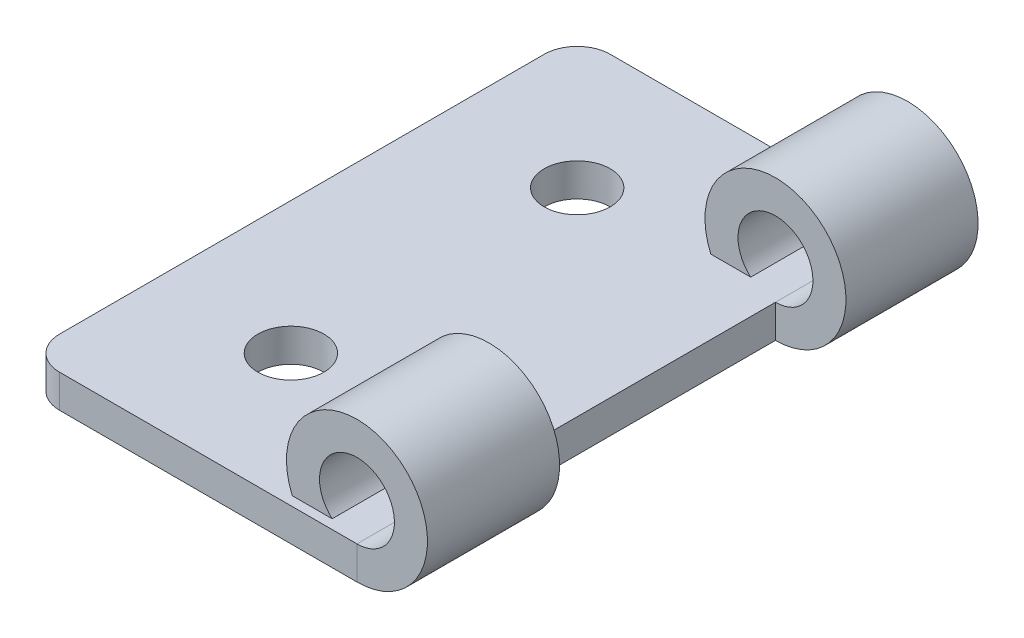
ISO-10303-21;
HEADER;
FILE_DESCRIPTION(('STEP AP214'),'2;1');
FILE_NAME('part.step','',(''),(''),'','','');
FILE_SCHEMA(('AUTOMOTIVE_DESIGN { 1 0 10303 214 1 1 1 1 }'));
ENDSEC;
DATA;
#1=APPLICATION_CONTEXT('core data for automotive mechanical design processes');
#2=APPLICATION_PROTOCOL_DEFINITION('international standard','automotive_design',2000,#1);
#3=PRODUCT_CONTEXT('',#1,'mechanical');
#4=PRODUCT('Part','Part','',(#3));
#5=PRODUCT_RELATED_PRODUCT_CATEGORY('part','',(#4));
#6=PRODUCT_DEFINITION_FORMATION('','',#4);
#7=PRODUCT_DEFINITION_CONTEXT('part definition',#1,'design');
#8=PRODUCT_DEFINITION('design','',#6,#7);
#9=PRODUCT_DEFINITION_SHAPE('','',#8);
#10=(LENGTH_UNIT() NAMED_UNIT(*) SI_UNIT(.MILLI.,.METRE.));
#11=(NAMED_UNIT(*) PLANE_ANGLE_UNIT() SI_UNIT($,.RADIAN.));
#12=(NAMED_UNIT(*) SI_UNIT($,.STERADIAN.) SOLID_ANGLE_UNIT());
#13=UNCERTAINTY_MEASURE_WITH_UNIT(LENGTH_MEASURE(1.E-05),#10,'distance_accuracy_value','');
#14=(GEOMETRIC_REPRESENTATION_CONTEXT(3) GLOBAL_UNCERTAINTY_ASSIGNED_CONTEXT((#13)) GLOBAL_UNIT_ASSIGNED_CONTEXT((#10,
#11,#12)) REPRESENTATION_CONTEXT('',''));
#15=CARTESIAN_POINT('',(0.,0.,0.));
#16=DIRECTION('',(0.,0.,1.));
#17=DIRECTION('',(1.,0.,0.));
#18=AXIS2_PLACEMENT_3D('',#15,#16,#17);
#19=CARTESIAN_POINT('',(15.,1.7,-25.));
#20=DIRECTION('',(0.,0.,1.));
#21=DIRECTION('',(1.,0.,0.));
#22=AXIS2_PLACEMENT_3D('',#19,#20,#21);
#23=CYLINDRICAL_SURFACE('',#22,3.2);
#24=DIRECTION('',(0.,0.,1.));
#25=VECTOR('',#24,1.);
#26=CARTESIAN_POINT('',(15.,-1.5,-25.));
#27=LINE('',#26,#25);
#28=CARTESIAN_POINT('',(15.,-1.5,-6.));
#29=VERTEX_POINT('',#28);
#30=CARTESIAN_POINT('',(15.,-1.5,0.));
#31=VERTEX_POINT('',#30);
#32=EDGE_CURVE('E115',#29,#31,#27,.T.);
#33=ORIENTED_EDGE('',*,*,#32,.F.);
#34=CARTESIAN_POINT('',(15.,1.7,-6.00000000000001));
#35=DIRECTION('',(0.,0.,1.));
#36=DIRECTION('',(1.,0.,0.));
#37=AXIS2_PLACEMENT_3D('',#34,#35,#36);
#38=CIRCLE('',#37,3.2);
#39=CARTESIAN_POINT('',(12.0648175965063,0.425361126349598,-6.00000000000001));
#40=VERTEX_POINT('',#39);
#41=EDGE_CURVE('E56',#40,#29,#38,.F.);
#42=ORIENTED_EDGE('',*,*,#41,.F.);
#43=DIRECTION('',(0.,0.,1.));
#44=VECTOR('',#43,1.);
#45=CARTESIAN_POINT('',(12.0648175965063,0.425361126349598,-25.));
#46=LINE('',#45,#44);
#47=CARTESIAN_POINT('',(12.0648175965063,0.425361126349598,0.));
#48=VERTEX_POINT('',#47);
#49=EDGE_CURVE('E114',#40,#48,#46,.T.);
#50=ORIENTED_EDGE('',*,*,#49,.T.);
#51=CARTESIAN_POINT('',(15.,1.7,0.));
#52=DIRECTION('',(0.,0.,1.));
#53=DIRECTION('',(1.,0.,0.));
#54=AXIS2_PLACEMENT_3D('',#51,#52,#53);
#55=CIRCLE('',#54,3.2);
#56=EDGE_CURVE('E105',#31,#48,#55,.T.);
#57=ORIENTED_EDGE('',*,*,#56,.F.);
#58=EDGE_LOOP('',(#33,#42,#50,#57));
#59=FACE_BOUND('',#58,.T.);
#60=ADVANCED_FACE('F47',(#59),#23,.T.);
#61=CARTESIAN_POINT('',(15.,0.,-25.));
#62=DIRECTION('',(-1.,0.,0.));
#63=DIRECTION('',(0.,0.,1.));
#64=AXIS2_PLACEMENT_3D('',#61,#62,#63);
#65=PLANE('',#64);
#66=DIRECTION('',(0.,1.,0.));
#67=VECTOR('',#66,1.);
#68=CARTESIAN_POINT('',(15.,-10.,-6.));
#69=LINE('',#68,#67);
#70=CARTESIAN_POINT('',(15.,0.,-6.));
#71=VERTEX_POINT('',#70);
#72=EDGE_CURVE('E12',#29,#71,#69,.T.);
#73=ORIENTED_EDGE('',*,*,#72,.F.);
#74=ORIENTED_EDGE('',*,*,#32,.T.);
#75=DIRECTION('',(0.,-1.,0.));
#76=VECTOR('',#75,1.);
#77=CARTESIAN_POINT('',(15.,0.,0.));
#78=LINE('',#77,#76);
#79=CARTESIAN_POINT('',(15.,0.,0.));
#80=VERTEX_POINT('',#79);
#81=EDGE_CURVE('E100',#80,#31,#78,.T.);
#82=ORIENTED_EDGE('',*,*,#81,.F.);
#83=DIRECTION('',(0.,0.,1.));
#84=VECTOR('',#83,1.);
#85=CARTESIAN_POINT('',(15.,0.,-25.));
#86=LINE('',#85,#84);
#87=EDGE_CURVE('E50',#71,#80,#86,.T.);
#88=ORIENTED_EDGE('',*,*,#87,.F.);
#89=EDGE_LOOP('',(#73,#74,#82,#88));
#90=FACE_BOUND('',#89,.T.);
#91=ADVANCED_FACE('F118',(#90),#65,.T.);
#92=CARTESIAN_POINT('',(15.,1.7,-25.));
#93=DIRECTION('',(0.,0.,1.));
#94=DIRECTION('',(1.,0.,0.));
#95=AXIS2_PLACEMENT_3D('',#92,#93,#94);
#96=CYLINDRICAL_SURFACE('',#95,1.7);
#97=CARTESIAN_POINT('',(15.,1.7,-6.00000000000001));
#98=DIRECTION('',(0.,0.,1.));
#99=DIRECTION('',(1.,0.,0.));
#100=AXIS2_PLACEMENT_3D('',#97,#98,#99);
#101=CIRCLE('',#100,1.7);
#102=CARTESIAN_POINT('',(13.8751463465058,0.425361126349597,-6.00000000000001));
#103=VERTEX_POINT('',#102);
#104=EDGE_CURVE('E106',#71,#103,#101,.T.);
#105=ORIENTED_EDGE('',*,*,#104,.F.);
#106=ORIENTED_EDGE('',*,*,#87,.T.);
#107=CARTESIAN_POINT('',(15.,1.7,0.));
#108=DIRECTION('',(0.,0.,-1.));
#109=DIRECTION('',(1.,0.,0.));
#110=AXIS2_PLACEMENT_3D('',#107,#108,#109);
#111=CIRCLE('',#110,1.7);
#112=CARTESIAN_POINT('',(13.8751463465058,0.425361126349597,0.));
#113=VERTEX_POINT('',#112);
#114=EDGE_CURVE('E92',#113,#80,#111,.T.);
#115=ORIENTED_EDGE('',*,*,#114,.F.);
#116=DIRECTION('',(0.,0.,1.));
#117=VECTOR('',#116,1.);
#118=CARTESIAN_POINT('',(13.8751463465058,0.425361126349597,-25.));
#119=LINE('',#118,#117);
#120=EDGE_CURVE('E84',#103,#113,#119,.T.);
#121=ORIENTED_EDGE('',*,*,#120,.F.);
#122=EDGE_LOOP('',(#105,#106,#115,#121));
#123=FACE_BOUND('',#122,.T.);
#124=ADVANCED_FACE('F95',(#123),#96,.F.);
#125=CARTESIAN_POINT('',(12.0648175965063,0.425361126349597,-25.));
#126=DIRECTION('',(0.,-1.,0.));
#127=DIRECTION('',(0.,0.,-1.));
#128=AXIS2_PLACEMENT_3D('',#125,#126,#127);
#129=PLANE('',#128);
#130=DIRECTION('',(-1.,0.,0.));
#131=VECTOR('',#130,1.);
#132=CARTESIAN_POINT('',(12.0648175965063,0.425361126349597,-6.00000000000001));
#133=LINE('',#132,#131);
#134=EDGE_CURVE('E90',#103,#40,#133,.T.);
#135=ORIENTED_EDGE('',*,*,#134,.F.);
#136=ORIENTED_EDGE('',*,*,#120,.T.);
#137=DIRECTION('',(1.,0.,0.));
#138=VECTOR('',#137,1.);
#139=CARTESIAN_POINT('',(12.0648175965063,0.425361126349597,0.));
#140=LINE('',#139,#138);
#141=EDGE_CURVE('E89',#48,#113,#140,.T.);
#142=ORIENTED_EDGE('',*,*,#141,.F.);
#143=ORIENTED_EDGE('',*,*,#49,.F.);
#144=EDGE_LOOP('',(#135,#136,#142,#143));
#145=FACE_BOUND('',#144,.T.);
#146=ADVANCED_FACE('F86',(#145),#129,.T.);
#147=CARTESIAN_POINT('',(15.,1.7,0.));
#148=DIRECTION('',(0.,0.,1.));
#149=DIRECTION('',(1.,0.,0.));
#150=AXIS2_PLACEMENT_3D('',#147,#148,#149);
#151=PLANE('',#150);
#152=ORIENTED_EDGE('',*,*,#114,.T.);
#153=ORIENTED_EDGE('',*,*,#81,.T.);
#154=ORIENTED_EDGE('',*,*,#56,.T.);
#155=ORIENTED_EDGE('',*,*,#141,.T.);
#156=EDGE_LOOP('',(#152,#153,#154,#155));
#157=FACE_BOUND('',#156,.T.);
#158=ADVANCED_FACE('F103',(#157),#151,.T.);
#159=CARTESIAN_POINT('',(18.2,0.,-6.));
#160=DIRECTION('',(0.,0.,1.));
#161=DIRECTION('',(1.,0.,0.));
#162=AXIS2_PLACEMENT_3D('',#159,#160,#161);
#163=PLANE('',#162);
#164=ORIENTED_EDGE('',*,*,#104,.T.);
#165=ORIENTED_EDGE('',*,*,#134,.T.);
#166=ORIENTED_EDGE('',*,*,#41,.T.);
#167=ORIENTED_EDGE('',*,*,#72,.T.);
#168=EDGE_LOOP('',(#164,#165,#166,#167));
#169=FACE_BOUND('',#168,.T.);
#170=ADVANCED_FACE('F121',(#169),#163,.F.);
#171=CLOSED_SHELL('',(#60,#91,#124,#146,#158,#170));
#172=MANIFOLD_SOLID_BREP('B2',#171);
#173=CARTESIAN_POINT('',(15.,1.7,-25.));
#174=DIRECTION('',(0.,0.,1.));
#175=DIRECTION('',(1.,0.,0.));
#176=AXIS2_PLACEMENT_3D('',#173,#174,#175);
#177=PLANE('',#176);
#178=CARTESIAN_POINT('',(15.,1.7,-25.));
#179=DIRECTION('',(0.,0.,-1.));
#180=DIRECTION('',(1.,0.,0.));
#181=AXIS2_PLACEMENT_3D('',#178,#179,#180);
#182=CIRCLE('',#181,1.7);
#183=CARTESIAN_POINT('',(13.8751463465058,0.425361126349597,-25.));
#184=VERTEX_POINT('',#183);
#185=CARTESIAN_POINT('',(15.,0.,-25.));
#186=VERTEX_POINT('',#185);
#187=EDGE_CURVE('E248',#184,#186,#182,.T.);
#188=ORIENTED_EDGE('',*,*,#187,.F.);
#189=DIRECTION('',(1.,0.,0.));
#190=VECTOR('',#189,1.);
#191=CARTESIAN_POINT('',(12.0648175965063,0.425361126349597,-25.));
#192=LINE('',#191,#190);
#193=CARTESIAN_POINT('',(12.0648175965063,0.425361126349598,-25.));
#194=VERTEX_POINT('',#193);
#195=EDGE_CURVE('E250',#194,#184,#192,.T.);
#196=ORIENTED_EDGE('',*,*,#195,.F.);
#197=CARTESIAN_POINT('',(15.,1.7,-25.));
#198=DIRECTION('',(0.,0.,1.));
#199=DIRECTION('',(1.,0.,0.));
#200=AXIS2_PLACEMENT_3D('',#197,#198,#199);
#201=CIRCLE('',#200,3.2);
#202=CARTESIAN_POINT('',(15.,-1.5,-25.));
#203=VERTEX_POINT('',#202);
#204=EDGE_CURVE('E252',#203,#194,#201,.T.);
#205=ORIENTED_EDGE('',*,*,#204,.F.);
#206=DIRECTION('',(0.,-1.,0.));
#207=VECTOR('',#206,1.);
#208=CARTESIAN_POINT('',(15.,0.,-25.));
#209=LINE('',#208,#207);
#210=EDGE_CURVE('E258',#186,#203,#209,.T.);
#211=ORIENTED_EDGE('',*,*,#210,.F.);
#212=EDGE_LOOP('',(#188,#196,#205,#211));
#213=FACE_BOUND('',#212,.T.);
#214=ADVANCED_FACE('F192',(#213),#177,.F.);
#215=CARTESIAN_POINT('',(12.0648175965063,0.425361126349597,-25.));
#216=DIRECTION('',(0.,-1.,0.));
#217=DIRECTION('',(0.,0.,-1.));
#218=AXIS2_PLACEMENT_3D('',#215,#216,#217);
#219=PLANE('',#218);
#220=DIRECTION('',(1.,0.,0.));
#221=VECTOR('',#220,1.);
#222=CARTESIAN_POINT('',(12.0648175965063,0.425361126349597,-19.));
#223=LINE('',#222,#221);
#224=CARTESIAN_POINT('',(12.0648175965063,0.425361126349598,-19.));
#225=VERTEX_POINT('',#224);
#226=CARTESIAN_POINT('',(13.8751463465058,0.425361126349597,-19.));
#227=VERTEX_POINT('',#226);
#228=EDGE_CURVE('E244',#225,#227,#223,.T.);
#229=ORIENTED_EDGE('',*,*,#228,.F.);
#230=DIRECTION('',(0.,0.,1.));
#231=VECTOR('',#230,1.);
#232=CARTESIAN_POINT('',(12.0648175965063,0.425361126349598,-25.));
#233=LINE('',#232,#231);
#234=EDGE_CURVE('E214',#194,#225,#233,.T.);
#235=ORIENTED_EDGE('',*,*,#234,.F.);
#236=ORIENTED_EDGE('',*,*,#195,.T.);
#237=DIRECTION('',(0.,0.,1.));
#238=VECTOR('',#237,1.);
#239=CARTESIAN_POINT('',(13.8751463465058,0.425361126349597,-25.));
#240=LINE('',#239,#238);
#241=EDGE_CURVE('E200',#184,#227,#240,.T.);
#242=ORIENTED_EDGE('',*,*,#241,.T.);
#243=EDGE_LOOP('',(#229,#235,#236,#242));
#244=FACE_BOUND('',#243,.T.);
#245=ADVANCED_FACE('F266',(#244),#219,.T.);
#246=CARTESIAN_POINT('',(15.,1.7,-25.));
#247=DIRECTION('',(0.,0.,1.));
#248=DIRECTION('',(1.,0.,0.));
#249=AXIS2_PLACEMENT_3D('',#246,#247,#248);
#250=CYLINDRICAL_SURFACE('',#249,1.7);
#251=CARTESIAN_POINT('',(15.,1.7,-19.));
#252=DIRECTION('',(0.,0.,-1.));
#253=DIRECTION('',(-1.,0.,0.));
#254=AXIS2_PLACEMENT_3D('',#251,#252,#253);
#255=CIRCLE('',#254,1.7);
#256=CARTESIAN_POINT('',(15.,0.,-19.));
#257=VERTEX_POINT('',#256);
#258=EDGE_CURVE('E246',#227,#257,#255,.T.);
#259=ORIENTED_EDGE('',*,*,#258,.F.);
#260=ORIENTED_EDGE('',*,*,#241,.F.);
#261=ORIENTED_EDGE('',*,*,#187,.T.);
#262=DIRECTION('',(0.,0.,1.));
#263=VECTOR('',#262,1.);
#264=CARTESIAN_POINT('',(15.,0.,-25.));
#265=LINE('',#264,#263);
#266=EDGE_CURVE('E240',#186,#257,#265,.T.);
#267=ORIENTED_EDGE('',*,*,#266,.T.);
#268=EDGE_LOOP('',(#259,#260,#261,#267));
#269=FACE_BOUND('',#268,.T.);
#270=ADVANCED_FACE('F194',(#269),#250,.F.);
#271=CARTESIAN_POINT('',(18.2,0.,-19.));
#272=DIRECTION('',(0.,0.,-1.));
#273=DIRECTION('',(-1.,0.,0.));
#274=AXIS2_PLACEMENT_3D('',#271,#272,#273);
#275=PLANE('',#274);
#276=ORIENTED_EDGE('',*,*,#258,.T.);
#277=DIRECTION('',(0.,1.,0.));
#278=VECTOR('',#277,1.);
#279=CARTESIAN_POINT('',(15.,-10.,-19.));
#280=LINE('',#279,#278);
#281=CARTESIAN_POINT('',(15.,-1.5,-19.));
#282=VERTEX_POINT('',#281);
#283=EDGE_CURVE('E235',#282,#257,#280,.T.);
#284=ORIENTED_EDGE('',*,*,#283,.F.);
#285=CARTESIAN_POINT('',(15.,1.7,-19.));
#286=DIRECTION('',(0.,0.,-1.));
#287=DIRECTION('',(-1.,0.,0.));
#288=AXIS2_PLACEMENT_3D('',#285,#286,#287);
#289=CIRCLE('',#288,3.2);
#290=EDGE_CURVE('E45',#282,#225,#289,.F.);
#291=ORIENTED_EDGE('',*,*,#290,.T.);
#292=ORIENTED_EDGE('',*,*,#228,.T.);
#293=EDGE_LOOP('',(#276,#284,#291,#292));
#294=FACE_BOUND('',#293,.T.);
#295=ADVANCED_FACE('F247',(#294),#275,.F.);
#296=CARTESIAN_POINT('',(15.,0.,-25.));
#297=DIRECTION('',(-1.,0.,0.));
#298=DIRECTION('',(0.,0.,1.));
#299=AXIS2_PLACEMENT_3D('',#296,#297,#298);
#300=PLANE('',#299);
#301=ORIENTED_EDGE('',*,*,#283,.T.);
#302=ORIENTED_EDGE('',*,*,#266,.F.);
#303=ORIENTED_EDGE('',*,*,#210,.T.);
#304=DIRECTION('',(0.,0.,1.));
#305=VECTOR('',#304,1.);
#306=CARTESIAN_POINT('',(15.,-1.5,-25.));
#307=LINE('',#306,#305);
#308=EDGE_CURVE('E242',#203,#282,#307,.T.);
#309=ORIENTED_EDGE('',*,*,#308,.T.);
#310=EDGE_LOOP('',(#301,#302,#303,#309));
#311=FACE_BOUND('',#310,.T.);
#312=ADVANCED_FACE('F237',(#311),#300,.T.);
#313=CARTESIAN_POINT('',(15.,1.7,-25.));
#314=DIRECTION('',(0.,0.,1.));
#315=DIRECTION('',(1.,0.,0.));
#316=AXIS2_PLACEMENT_3D('',#313,#314,#315);
#317=CYLINDRICAL_SURFACE('',#316,3.2);
#318=ORIENTED_EDGE('',*,*,#290,.F.);
#319=ORIENTED_EDGE('',*,*,#308,.F.);
#320=ORIENTED_EDGE('',*,*,#204,.T.);
#321=ORIENTED_EDGE('',*,*,#234,.T.);
#322=EDGE_LOOP('',(#318,#319,#320,#321));
#323=FACE_BOUND('',#322,.T.);
#324=ADVANCED_FACE('F265',(#323),#317,.T.);
#325=CLOSED_SHELL('',(#214,#245,#270,#295,#312,#324));
#326=MANIFOLD_SOLID_BREP('B6',#325);
#327=CARTESIAN_POINT('',(0.,-1.5,0.));
#328=DIRECTION('',(-1.,0.,0.));
#329=DIRECTION('',(0.,0.,1.));
#330=AXIS2_PLACEMENT_3D('',#327,#328,#329);
#331=PLANE('',#330);
#332=DIRECTION('',(0.,0.,1.));
#333=VECTOR('',#332,1.);
#334=CARTESIAN_POINT('',(0.,0.,0.));
#335=LINE('',#334,#333);
#336=CARTESIAN_POINT('',(0.,0.,-23.5));
#337=VERTEX_POINT('',#336);
#338=CARTESIAN_POINT('',(0.,0.,-1.5));
#339=VERTEX_POINT('',#338);
#340=EDGE_CURVE('E403',#337,#339,#335,.T.);
#341=ORIENTED_EDGE('',*,*,#340,.F.);
#342=DIRECTION('',(0.,1.,0.));
#343=VECTOR('',#342,1.);
#344=CARTESIAN_POINT('',(0.,-1.5,-23.5));
#345=LINE('',#344,#343);
#346=CARTESIAN_POINT('',(0.,-1.5,-23.5));
#347=VERTEX_POINT('',#346);
#348=EDGE_CURVE('E424',#337,#347,#345,.F.);
#349=ORIENTED_EDGE('',*,*,#348,.T.);
#350=DIRECTION('',(0.,0.,1.));
#351=VECTOR('',#350,1.);
#352=CARTESIAN_POINT('',(0.,-1.5,0.));
#353=LINE('',#352,#351);
#354=CARTESIAN_POINT('',(0.,-1.5,-1.5));
#355=VERTEX_POINT('',#354);
#356=EDGE_CURVE('E386',#347,#355,#353,.T.);
#357=ORIENTED_EDGE('',*,*,#356,.T.);
#358=DIRECTION('',(0.,1.,0.));
#359=VECTOR('',#358,1.);
#360=CARTESIAN_POINT('',(0.,-1.5,-1.5));
#361=LINE('',#360,#359);
#362=EDGE_CURVE('E421',#355,#339,#361,.T.);
#363=ORIENTED_EDGE('',*,*,#362,.T.);
#364=EDGE_LOOP('',(#341,#349,#357,#363));
#365=FACE_BOUND('',#364,.T.);
#366=ADVANCED_FACE('F328',(#365),#331,.T.);
#367=CARTESIAN_POINT('',(0.,-1.5,-25.));
#368=DIRECTION('',(0.,0.,-1.));
#369=DIRECTION('',(-1.,0.,0.));
#370=AXIS2_PLACEMENT_3D('',#367,#368,#369);
#371=PLANE('',#370);
#372=DIRECTION('',(-1.,0.,0.));
#373=VECTOR('',#372,1.);
#374=CARTESIAN_POINT('',(0.,-1.5,-25.));
#375=LINE('',#374,#373);
#376=CARTESIAN_POINT('',(15.,-1.5,-25.));
#377=VERTEX_POINT('',#376);
#378=CARTESIAN_POINT('',(1.5,-1.5,-25.));
#379=VERTEX_POINT('',#378);
#380=EDGE_CURVE('E395',#377,#379,#375,.T.);
#381=ORIENTED_EDGE('',*,*,#380,.T.);
#382=DIRECTION('',(0.,1.,0.));
#383=VECTOR('',#382,1.);
#384=CARTESIAN_POINT('',(1.5,-1.5,-25.));
#385=LINE('',#384,#383);
#386=CARTESIAN_POINT('',(1.5,0.,-25.));
#387=VERTEX_POINT('',#386);
#388=EDGE_CURVE('E413',#379,#387,#385,.T.);
#389=ORIENTED_EDGE('',*,*,#388,.T.);
#390=DIRECTION('',(-1.,0.,0.));
#391=VECTOR('',#390,1.);
#392=CARTESIAN_POINT('',(0.,0.,-25.));
#393=LINE('',#392,#391);
#394=CARTESIAN_POINT('',(15.,0.,-25.));
#395=VERTEX_POINT('',#394);
#396=EDGE_CURVE('E410',#395,#387,#393,.T.);
#397=ORIENTED_EDGE('',*,*,#396,.F.);
#398=DIRECTION('',(0.,1.,0.));
#399=VECTOR('',#398,1.);
#400=CARTESIAN_POINT('',(15.,-1.5,-25.));
#401=LINE('',#400,#399);
#402=EDGE_CURVE('E394',#377,#395,#401,.T.);
#403=ORIENTED_EDGE('',*,*,#402,.F.);
#404=EDGE_LOOP('',(#381,#389,#397,#403));
#405=FACE_BOUND('',#404,.T.);
#406=ADVANCED_FACE('F431',(#405),#371,.T.);
#407=CARTESIAN_POINT('',(15.,-1.5,0.));
#408=DIRECTION('',(1.,0.,0.));
#409=DIRECTION('',(0.,0.,-1.));
#410=AXIS2_PLACEMENT_3D('',#407,#408,#409);
#411=PLANE('',#410);
#412=DIRECTION('',(0.,0.,-1.));
#413=VECTOR('',#412,1.);
#414=CARTESIAN_POINT('',(15.,0.,0.));
#415=LINE('',#414,#413);
#416=CARTESIAN_POINT('',(15.,0.,0.));
#417=VERTEX_POINT('',#416);
#418=EDGE_CURVE('E393',#417,#395,#415,.T.);
#419=ORIENTED_EDGE('',*,*,#418,.F.);
#420=DIRECTION('',(0.,1.,0.));
#421=VECTOR('',#420,1.);
#422=CARTESIAN_POINT('',(15.,-1.5,0.));
#423=LINE('',#422,#421);
#424=CARTESIAN_POINT('',(15.,-1.5,0.));
#425=VERTEX_POINT('',#424);
#426=EDGE_CURVE('E382',#425,#417,#423,.T.);
#427=ORIENTED_EDGE('',*,*,#426,.F.);
#428=DIRECTION('',(0.,0.,-1.));
#429=VECTOR('',#428,1.);
#430=CARTESIAN_POINT('',(15.,-1.5,0.));
#431=LINE('',#430,#429);
#432=EDGE_CURVE('E385',#425,#377,#431,.T.);
#433=ORIENTED_EDGE('',*,*,#432,.T.);
#434=ORIENTED_EDGE('',*,*,#402,.T.);
#435=EDGE_LOOP('',(#419,#427,#433,#434));
#436=FACE_BOUND('',#435,.T.);
#437=ADVANCED_FACE('F390',(#436),#411,.T.);
#438=CARTESIAN_POINT('',(0.,-1.5,0.));
#439=DIRECTION('',(0.,0.,1.));
#440=DIRECTION('',(1.,0.,0.));
#441=AXIS2_PLACEMENT_3D('',#438,#439,#440);
#442=PLANE('',#441);
#443=DIRECTION('',(1.,0.,0.));
#444=VECTOR('',#443,1.);
#445=CARTESIAN_POINT('',(0.,0.,0.));
#446=LINE('',#445,#444);
#447=CARTESIAN_POINT('',(1.5,0.,0.));
#448=VERTEX_POINT('',#447);
#449=EDGE_CURVE('E406',#448,#417,#446,.T.);
#450=ORIENTED_EDGE('',*,*,#449,.F.);
#451=DIRECTION('',(0.,1.,0.));
#452=VECTOR('',#451,1.);
#453=CARTESIAN_POINT('',(1.5,-1.5,0.));
#454=LINE('',#453,#452);
#455=CARTESIAN_POINT('',(1.5,-1.5,0.));
#456=VERTEX_POINT('',#455);
#457=EDGE_CURVE('E190',#448,#456,#454,.F.);
#458=ORIENTED_EDGE('',*,*,#457,.T.);
#459=DIRECTION('',(1.,0.,0.));
#460=VECTOR('',#459,1.);
#461=CARTESIAN_POINT('',(0.,-1.5,0.));
#462=LINE('',#461,#460);
#463=EDGE_CURVE('E379',#456,#425,#462,.T.);
#464=ORIENTED_EDGE('',*,*,#463,.T.);
#465=ORIENTED_EDGE('',*,*,#426,.T.);
#466=EDGE_LOOP('',(#450,#458,#464,#465));
#467=FACE_BOUND('',#466,.T.);
#468=ADVANCED_FACE('F381',(#467),#442,.T.);
#469=CARTESIAN_POINT('',(0.,-1.5,0.));
#470=DIRECTION('',(0.,-1.,0.));
#471=DIRECTION('',(0.,0.,-1.));
#472=AXIS2_PLACEMENT_3D('',#469,#470,#471);
#473=PLANE('',#472);
#474=CARTESIAN_POINT('',(6.,-1.5,-6.));
#475=DIRECTION('',(0.,-1.,0.));
#476=DIRECTION('',(0.,0.,-1.));
#477=AXIS2_PLACEMENT_3D('',#474,#475,#476);
#478=CIRCLE('',#477,1.5);
#479=CARTESIAN_POINT('',(6.,-1.5,-7.50000000000001));
#480=VERTEX_POINT('',#479);
#481=EDGE_CURVE('E473',#480,#480,#478,.T.);
#482=ORIENTED_EDGE('',*,*,#481,.F.);
#483=EDGE_LOOP('',(#482));
#484=FACE_BOUND('',#483,.T.);
#485=CARTESIAN_POINT('',(6.,-1.5,-19.));
#486=DIRECTION('',(0.,-1.,0.));
#487=DIRECTION('',(0.,0.,-1.));
#488=AXIS2_PLACEMENT_3D('',#485,#486,#487);
#489=CIRCLE('',#488,1.5);
#490=CARTESIAN_POINT('',(6.,-1.5,-20.5));
#491=VERTEX_POINT('',#490);
#492=EDGE_CURVE('E407',#491,#491,#489,.T.);
#493=ORIENTED_EDGE('',*,*,#492,.F.);
#494=EDGE_LOOP('',(#493));
#495=FACE_BOUND('',#494,.T.);
#496=ORIENTED_EDGE('',*,*,#356,.F.);
#497=CARTESIAN_POINT('',(1.5,-1.5,-23.5));
#498=DIRECTION('',(0.,-1.,0.));
#499=DIRECTION('',(0.,0.,-1.));
#500=AXIS2_PLACEMENT_3D('',#497,#498,#499);
#501=CIRCLE('',#500,1.5);
#502=EDGE_CURVE('E336',#347,#379,#501,.T.);
#503=ORIENTED_EDGE('',*,*,#502,.T.);
#504=ORIENTED_EDGE('',*,*,#380,.F.);
#505=ORIENTED_EDGE('',*,*,#432,.F.);
#506=ORIENTED_EDGE('',*,*,#463,.F.);
#507=CARTESIAN_POINT('',(1.5,-1.5,-1.5));
#508=DIRECTION('',(0.,-1.,0.));
#509=DIRECTION('',(0.,0.,-1.));
#510=AXIS2_PLACEMENT_3D('',#507,#508,#509);
#511=CIRCLE('',#510,1.5);
#512=EDGE_CURVE('E348',#456,#355,#511,.T.);
#513=ORIENTED_EDGE('',*,*,#512,.T.);
#514=EDGE_LOOP('',(#496,#503,#504,#505,#506,#513));
#515=FACE_BOUND('',#514,.T.);
#516=ADVANCED_FACE('F397',(#484,#495,#515),#473,.T.);
#517=CARTESIAN_POINT('',(0.,0.,0.));
#518=DIRECTION('',(0.,-1.,0.));
#519=DIRECTION('',(0.,0.,-1.));
#520=AXIS2_PLACEMENT_3D('',#517,#518,#519);
#521=PLANE('',#520);
#522=CARTESIAN_POINT('',(6.,0.,-6.));
#523=DIRECTION('',(0.,1.,0.));
#524=DIRECTION('',(0.,0.,1.));
#525=AXIS2_PLACEMENT_3D('',#522,#523,#524);
#526=CIRCLE('',#525,1.5);
#527=CARTESIAN_POINT('',(6.,0.,-4.5));
#528=VERTEX_POINT('',#527);
#529=EDGE_CURVE('E476',#528,#528,#526,.T.);
#530=ORIENTED_EDGE('',*,*,#529,.F.);
#531=EDGE_LOOP('',(#530));
#532=FACE_BOUND('',#531,.T.);
#533=CARTESIAN_POINT('',(6.,0.,-19.));
#534=DIRECTION('',(0.,1.,0.));
#535=DIRECTION('',(0.,0.,1.));
#536=AXIS2_PLACEMENT_3D('',#533,#534,#535);
#537=CIRCLE('',#536,1.5);
#538=CARTESIAN_POINT('',(6.,0.,-17.5));
#539=VERTEX_POINT('',#538);
#540=EDGE_CURVE('E478',#539,#539,#537,.T.);
#541=ORIENTED_EDGE('',*,*,#540,.F.);
#542=EDGE_LOOP('',(#541));
#543=FACE_BOUND('',#542,.T.);
#544=ORIENTED_EDGE('',*,*,#396,.T.);
#545=CARTESIAN_POINT('',(1.5,0.,-23.5));
#546=DIRECTION('',(0.,-1.,0.));
#547=DIRECTION('',(0.,0.,-1.));
#548=AXIS2_PLACEMENT_3D('',#545,#546,#547);
#549=CIRCLE('',#548,1.5);
#550=EDGE_CURVE('E419',#387,#337,#549,.F.);
#551=ORIENTED_EDGE('',*,*,#550,.T.);
#552=ORIENTED_EDGE('',*,*,#340,.T.);
#553=CARTESIAN_POINT('',(1.5,0.,-1.5));
#554=DIRECTION('',(0.,-1.,0.));
#555=DIRECTION('',(0.,0.,-1.));
#556=AXIS2_PLACEMENT_3D('',#553,#554,#555);
#557=CIRCLE('',#556,1.5);
#558=EDGE_CURVE('E417',#339,#448,#557,.F.);
#559=ORIENTED_EDGE('',*,*,#558,.T.);
#560=ORIENTED_EDGE('',*,*,#449,.T.);
#561=ORIENTED_EDGE('',*,*,#418,.T.);
#562=EDGE_LOOP('',(#544,#551,#552,#559,#560,#561));
#563=FACE_BOUND('',#562,.T.);
#564=ADVANCED_FACE('F436',(#532,#543,#563),#521,.F.);
#565=CARTESIAN_POINT('',(6.,-10.,-19.));
#566=DIRECTION('',(0.,1.,0.));
#567=DIRECTION('',(0.,0.,1.));
#568=AXIS2_PLACEMENT_3D('',#565,#566,#567);
#569=CYLINDRICAL_SURFACE('',#568,1.5);
#570=ORIENTED_EDGE('',*,*,#492,.T.);
#571=EDGE_LOOP('',(#570));
#572=FACE_BOUND('',#571,.T.);
#573=ORIENTED_EDGE('',*,*,#540,.T.);
#574=EDGE_LOOP('',(#573));
#575=FACE_BOUND('',#574,.T.);
#576=ADVANCED_FACE('F458',(#572,#575),#569,.F.);
#577=CARTESIAN_POINT('',(6.,-10.,-6.));
#578=DIRECTION('',(0.,1.,0.));
#579=DIRECTION('',(0.,0.,1.));
#580=AXIS2_PLACEMENT_3D('',#577,#578,#579);
#581=CYLINDRICAL_SURFACE('',#580,1.5);
#582=ORIENTED_EDGE('',*,*,#481,.T.);
#583=EDGE_LOOP('',(#582));
#584=FACE_BOUND('',#583,.T.);
#585=ORIENTED_EDGE('',*,*,#529,.T.);
#586=EDGE_LOOP('',(#585));
#587=FACE_BOUND('',#586,.T.);
#588=ADVANCED_FACE('F444',(#584,#587),#581,.F.);
#589=CARTESIAN_POINT('',(1.5,-1.5,-23.5));
#590=DIRECTION('',(0.,1.,0.));
#591=DIRECTION('',(0.,0.,1.));
#592=AXIS2_PLACEMENT_3D('',#589,#590,#591);
#593=CYLINDRICAL_SURFACE('',#592,1.5);
#594=ORIENTED_EDGE('',*,*,#502,.F.);
#595=ORIENTED_EDGE('',*,*,#348,.F.);
#596=ORIENTED_EDGE('',*,*,#550,.F.);
#597=ORIENTED_EDGE('',*,*,#388,.F.);
#598=EDGE_LOOP('',(#594,#595,#596,#597));
#599=FACE_BOUND('',#598,.T.);
#600=ADVANCED_FACE('F433',(#599),#593,.T.);
#601=CARTESIAN_POINT('',(1.5,-1.5,-1.5));
#602=DIRECTION('',(0.,1.,0.));
#603=DIRECTION('',(0.,0.,1.));
#604=AXIS2_PLACEMENT_3D('',#601,#602,#603);
#605=CYLINDRICAL_SURFACE('',#604,1.5);
#606=ORIENTED_EDGE('',*,*,#512,.F.);
#607=ORIENTED_EDGE('',*,*,#457,.F.);
#608=ORIENTED_EDGE('',*,*,#558,.F.);
#609=ORIENTED_EDGE('',*,*,#362,.F.);
#610=EDGE_LOOP('',(#606,#607,#608,#609));
#611=FACE_BOUND('',#610,.T.);
#612=ADVANCED_FACE('F330',(#611),#605,.T.);
#613=CLOSED_SHELL('',(#366,#406,#437,#468,#516,#564,#576,#588,#600,#612));
#614=MANIFOLD_SOLID_BREP('B39',#613);
#615=ADVANCED_BREP_SHAPE_REPRESENTATION('',(#18,#172,#326,#614),#14);
#616=SHAPE_DEFINITION_REPRESENTATION(#9,#615);
ENDSEC;
END-ISO-10303-21;
